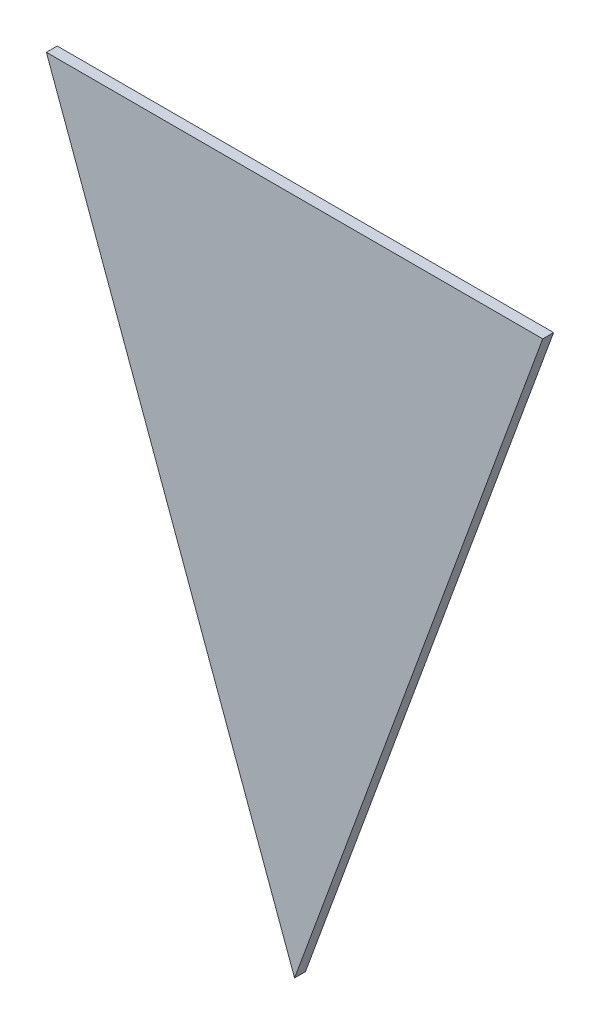
ISO-10303-21;
HEADER;
FILE_DESCRIPTION(('STEP AP214'),'2;1');
FILE_NAME('part.step','',(''),(''),'','','');
FILE_SCHEMA(('AUTOMOTIVE_DESIGN { 1 0 10303 214 1 1 1 1 }'));
ENDSEC;
DATA;
#1=APPLICATION_CONTEXT('core data for automotive mechanical design processes');
#2=APPLICATION_PROTOCOL_DEFINITION('international standard','automotive_design',2000,#1);
#3=PRODUCT_CONTEXT('',#1,'mechanical');
#4=PRODUCT('Part','Part','',(#3));
#5=PRODUCT_RELATED_PRODUCT_CATEGORY('part','',(#4));
#6=PRODUCT_DEFINITION_FORMATION('','',#4);
#7=PRODUCT_DEFINITION_CONTEXT('part definition',#1,'design');
#8=PRODUCT_DEFINITION('design','',#6,#7);
#9=PRODUCT_DEFINITION_SHAPE('','',#8);
#10=(LENGTH_UNIT() NAMED_UNIT(*) SI_UNIT(.MILLI.,.METRE.));
#11=(NAMED_UNIT(*) PLANE_ANGLE_UNIT() SI_UNIT($,.RADIAN.));
#12=(NAMED_UNIT(*) SI_UNIT($,.STERADIAN.) SOLID_ANGLE_UNIT());
#13=UNCERTAINTY_MEASURE_WITH_UNIT(LENGTH_MEASURE(1.E-05),#10,'distance_accuracy_value','');
#14=(GEOMETRIC_REPRESENTATION_CONTEXT(3) GLOBAL_UNCERTAINTY_ASSIGNED_CONTEXT((#13)) GLOBAL_UNIT_ASSIGNED_CONTEXT((#10,
#11,#12)) REPRESENTATION_CONTEXT('',''));
#15=CARTESIAN_POINT('',(0.,0.,0.));
#16=DIRECTION('',(0.,0.,1.));
#17=DIRECTION('',(1.,0.,0.));
#18=AXIS2_PLACEMENT_3D('',#15,#16,#17);
#19=CARTESIAN_POINT('',(0.,0.,0.));
#20=DIRECTION('',(0.,0.,-1.));
#21=DIRECTION('',(0.,-1.,0.));
#22=AXIS2_PLACEMENT_3D('',#19,#20,#21);
#23=PLANE('',#22);
#24=DIRECTION('',(0.343933810246061,-0.938993894639165,0.));
#25=VECTOR('',#24,1.);
#26=CARTESIAN_POINT('',(-0.35504460079,0.276950890412,0.));
#27=LINE('',#26,#25);
#28=CARTESIAN_POINT('',(-0.583287558441,0.90009039384,0.));
#29=VERTEX_POINT('',#28);
#30=CARTESIAN_POINT('',(-0.35504460079,0.276950890412,0.));
#31=VERTEX_POINT('',#30);
#32=EDGE_CURVE('E77',#29,#31,#27,.T.);
#33=ORIENTED_EDGE('',*,*,#32,.F.);
#34=DIRECTION('',(-1.,0.,0.));
#35=VECTOR('',#34,1.);
#36=CARTESIAN_POINT('',(-0.583287558441,0.90009039384,0.));
#37=LINE('',#36,#35);
#38=CARTESIAN_POINT('',(-0.126801643139,0.90009039384,0.));
#39=VERTEX_POINT('',#38);
#40=EDGE_CURVE('E20',#39,#29,#37,.T.);
#41=ORIENTED_EDGE('',*,*,#40,.F.);
#42=DIRECTION('',(0.343933810246061,0.938993894639165,0.));
#43=VECTOR('',#42,1.);
#44=CARTESIAN_POINT('',(-0.126801643139,0.90009039384,0.));
#45=LINE('',#44,#43);
#46=EDGE_CURVE('E64',#31,#39,#45,.T.);
#47=ORIENTED_EDGE('',*,*,#46,.F.);
#48=EDGE_LOOP('',(#33,#41,#47));
#49=FACE_BOUND('',#48,.T.);
#50=ADVANCED_FACE('F17',(#49),#23,.T.);
#51=CARTESIAN_POINT('',(0.,0.,0.01));
#52=DIRECTION('',(0.,0.,-1.));
#53=DIRECTION('',(0.,-1.,0.));
#54=AXIS2_PLACEMENT_3D('',#51,#52,#53);
#55=PLANE('',#54);
#56=DIRECTION('',(0.343933810246061,-0.938993894639165,0.));
#57=VECTOR('',#56,1.);
#58=CARTESIAN_POINT('',(-0.35504460079,0.276950890412,0.01));
#59=LINE('',#58,#57);
#60=CARTESIAN_POINT('',(-0.583287558441,0.90009039384,0.01));
#61=VERTEX_POINT('',#60);
#62=CARTESIAN_POINT('',(-0.35504460079,0.276950890412,0.01));
#63=VERTEX_POINT('',#62);
#64=EDGE_CURVE('E78',#61,#63,#59,.T.);
#65=ORIENTED_EDGE('',*,*,#64,.T.);
#66=DIRECTION('',(0.343933810246061,0.938993894639165,0.));
#67=VECTOR('',#66,1.);
#68=CARTESIAN_POINT('',(-0.126801643139,0.90009039384,0.01));
#69=LINE('',#68,#67);
#70=CARTESIAN_POINT('',(-0.126801643139,0.90009039384,0.01));
#71=VERTEX_POINT('',#70);
#72=EDGE_CURVE('E58',#63,#71,#69,.T.);
#73=ORIENTED_EDGE('',*,*,#72,.T.);
#74=DIRECTION('',(-1.,0.,0.));
#75=VECTOR('',#74,1.);
#76=CARTESIAN_POINT('',(-0.583287558441,0.90009039384,0.01));
#77=LINE('',#76,#75);
#78=EDGE_CURVE('E11',#71,#61,#77,.T.);
#79=ORIENTED_EDGE('',*,*,#78,.T.);
#80=EDGE_LOOP('',(#65,#73,#79));
#81=FACE_BOUND('',#80,.T.);
#82=ADVANCED_FACE('F100',(#81),#55,.F.);
#83=CARTESIAN_POINT('',(-0.583287558441,0.90009039384,0.01));
#84=DIRECTION('',(0.,-1.,0.));
#85=DIRECTION('',(0.,0.,-1.));
#86=AXIS2_PLACEMENT_3D('',#83,#84,#85);
#87=PLANE('',#86);
#88=ORIENTED_EDGE('',*,*,#40,.T.);
#89=DIRECTION('',(0.,0.,-1.));
#90=VECTOR('',#89,1.);
#91=CARTESIAN_POINT('',(-0.583287558441,0.90009039384,0.01));
#92=LINE('',#91,#90);
#93=EDGE_CURVE('E69',#61,#29,#92,.T.);
#94=ORIENTED_EDGE('',*,*,#93,.F.);
#95=ORIENTED_EDGE('',*,*,#78,.F.);
#96=DIRECTION('',(0.,0.,-1.));
#97=VECTOR('',#96,1.);
#98=CARTESIAN_POINT('',(-0.126801643139,0.90009039384,0.01));
#99=LINE('',#98,#97);
#100=EDGE_CURVE('E71',#71,#39,#99,.T.);
#101=ORIENTED_EDGE('',*,*,#100,.T.);
#102=EDGE_LOOP('',(#88,#94,#95,#101));
#103=FACE_BOUND('',#102,.T.);
#104=ADVANCED_FACE('F68',(#103),#87,.F.);
#105=CARTESIAN_POINT('',(-0.126801643139,0.90009039384,0.01));
#106=DIRECTION('',(-0.938993894639165,0.343933810246061,0.));
#107=DIRECTION('',(0.,0.,1.));
#108=AXIS2_PLACEMENT_3D('',#105,#106,#107);
#109=PLANE('',#108);
#110=ORIENTED_EDGE('',*,*,#46,.T.);
#111=ORIENTED_EDGE('',*,*,#100,.F.);
#112=ORIENTED_EDGE('',*,*,#72,.F.);
#113=DIRECTION('',(0.,0.,-1.));
#114=VECTOR('',#113,1.);
#115=CARTESIAN_POINT('',(-0.35504460079,0.276950890412,0.01));
#116=LINE('',#115,#114);
#117=EDGE_CURVE('E82',#63,#31,#116,.T.);
#118=ORIENTED_EDGE('',*,*,#117,.T.);
#119=EDGE_LOOP('',(#110,#111,#112,#118));
#120=FACE_BOUND('',#119,.T.);
#121=ADVANCED_FACE('F101',(#120),#109,.F.);
#122=CARTESIAN_POINT('',(-0.35504460079,0.276950890412,0.01));
#123=DIRECTION('',(0.938993894639165,0.343933810246061,0.));
#124=DIRECTION('',(0.,0.,-1.));
#125=AXIS2_PLACEMENT_3D('',#122,#123,#124);
#126=PLANE('',#125);
#127=ORIENTED_EDGE('',*,*,#32,.T.);
#128=ORIENTED_EDGE('',*,*,#117,.F.);
#129=ORIENTED_EDGE('',*,*,#64,.F.);
#130=ORIENTED_EDGE('',*,*,#93,.T.);
#131=EDGE_LOOP('',(#127,#128,#129,#130));
#132=FACE_BOUND('',#131,.T.);
#133=ADVANCED_FACE('F75',(#132),#126,.F.);
#134=CLOSED_SHELL('',(#50,#82,#104,#121,#133));
#135=MANIFOLD_SOLID_BREP('B1',#134);
#136=ADVANCED_BREP_SHAPE_REPRESENTATION('',(#18,#135),#14);
#137=SHAPE_DEFINITION_REPRESENTATION(#9,#136);
ENDSEC;
END-ISO-10303-21;
